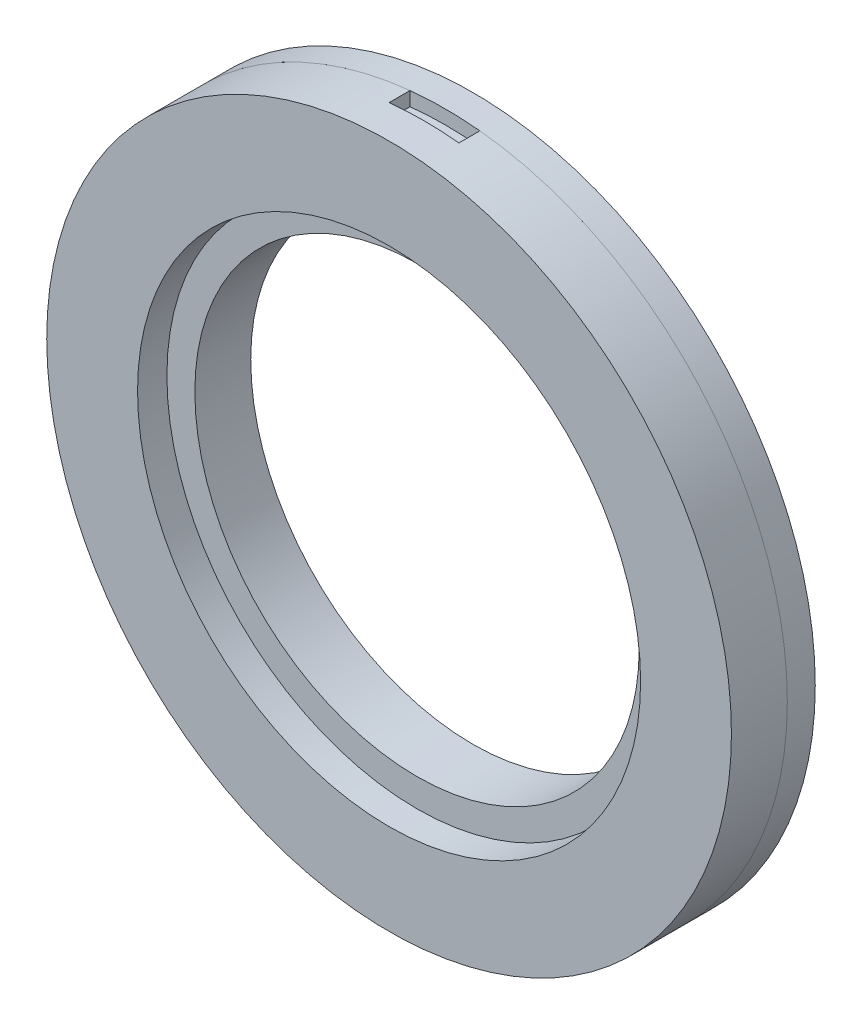
ISO-10303-21;
HEADER;
FILE_DESCRIPTION(('STEP AP214'),'2;1');
FILE_NAME('part.step','',(''),(''),'','','');
FILE_SCHEMA(('AUTOMOTIVE_DESIGN { 1 0 10303 214 1 1 1 1 }'));
ENDSEC;
DATA;
#1=APPLICATION_CONTEXT('core data for automotive mechanical design processes');
#2=APPLICATION_PROTOCOL_DEFINITION('international standard','automotive_design',2000,#1);
#3=PRODUCT_CONTEXT('',#1,'mechanical');
#4=PRODUCT('Part','Part','',(#3));
#5=PRODUCT_RELATED_PRODUCT_CATEGORY('part','',(#4));
#6=PRODUCT_DEFINITION_FORMATION('','',#4);
#7=PRODUCT_DEFINITION_CONTEXT('part definition',#1,'design');
#8=PRODUCT_DEFINITION('design','',#6,#7);
#9=PRODUCT_DEFINITION_SHAPE('','',#8);
#10=(LENGTH_UNIT() NAMED_UNIT(*) SI_UNIT(.MILLI.,.METRE.));
#11=(NAMED_UNIT(*) PLANE_ANGLE_UNIT() SI_UNIT($,.RADIAN.));
#12=(NAMED_UNIT(*) SI_UNIT($,.STERADIAN.) SOLID_ANGLE_UNIT());
#13=UNCERTAINTY_MEASURE_WITH_UNIT(LENGTH_MEASURE(1.E-05),#10,'distance_accuracy_value','');
#14=(GEOMETRIC_REPRESENTATION_CONTEXT(3) GLOBAL_UNCERTAINTY_ASSIGNED_CONTEXT((#13)) GLOBAL_UNIT_ASSIGNED_CONTEXT((#10,
#11,#12)) REPRESENTATION_CONTEXT('',''));
#15=CARTESIAN_POINT('',(0.,0.,0.));
#16=DIRECTION('',(0.,0.,1.));
#17=DIRECTION('',(1.,0.,0.));
#18=AXIS2_PLACEMENT_3D('',#15,#16,#17);
#19=CARTESIAN_POINT('',(0.,0.,0.));
#20=DIRECTION('',(0.,0.,-1.));
#21=DIRECTION('',(-1.,0.,0.));
#22=AXIS2_PLACEMENT_3D('',#19,#20,#21);
#23=PLANE('',#22);
#24=CARTESIAN_POINT('',(0.,0.,0.));
#25=DIRECTION('',(0.,0.,1.));
#26=DIRECTION('',(1.,0.,0.));
#27=AXIS2_PLACEMENT_3D('',#24,#25,#26);
#28=CIRCLE('',#27,17.9);
#29=CARTESIAN_POINT('',(17.9,0.,0.));
#30=VERTEX_POINT('',#29);
#31=EDGE_CURVE('E66',#30,#30,#28,.T.);
#32=ORIENTED_EDGE('',*,*,#31,.F.);
#33=EDGE_LOOP('',(#32));
#34=FACE_BOUND('',#33,.T.);
#35=CARTESIAN_POINT('',(0.,0.,0.));
#36=DIRECTION('',(0.,0.,-1.));
#37=DIRECTION('',(-1.,0.,0.));
#38=AXIS2_PLACEMENT_3D('',#35,#36,#37);
#39=CIRCLE('',#38,20.);
#40=CARTESIAN_POINT('',(-20.,0.,0.));
#41=VERTEX_POINT('',#40);
#42=EDGE_CURVE('E12',#41,#41,#39,.T.);
#43=ORIENTED_EDGE('',*,*,#42,.F.);
#44=EDGE_LOOP('',(#43));
#45=FACE_BOUND('',#44,.T.);
#46=ADVANCED_FACE('F58',(#34,#45),#23,.F.);
#47=CARTESIAN_POINT('',(0.,0.,-2.));
#48=DIRECTION('',(0.,0.,1.));
#49=DIRECTION('',(1.,0.,0.));
#50=AXIS2_PLACEMENT_3D('',#47,#48,#49);
#51=CYLINDRICAL_SURFACE('',#50,24.5);
#52=CARTESIAN_POINT('',(0.,0.,-2.));
#53=DIRECTION('',(0.,0.,-1.));
#54=DIRECTION('',(-1.,0.,0.));
#55=AXIS2_PLACEMENT_3D('',#52,#53,#54);
#56=CIRCLE('',#55,24.5);
#57=CARTESIAN_POINT('',(-24.5,0.,-2.));
#58=VERTEX_POINT('',#57);
#59=EDGE_CURVE('E71',#58,#58,#56,.T.);
#60=ORIENTED_EDGE('',*,*,#59,.F.);
#61=EDGE_LOOP('',(#60));
#62=FACE_BOUND('',#61,.T.);
#63=CARTESIAN_POINT('',(0.,0.,0.));
#64=DIRECTION('',(0.,0.,-1.));
#65=DIRECTION('',(-1.,0.,0.));
#66=AXIS2_PLACEMENT_3D('',#63,#64,#65);
#67=CIRCLE('',#66,24.5);
#68=CARTESIAN_POINT('',(-24.5,0.,0.));
#69=VERTEX_POINT('',#68);
#70=EDGE_CURVE('E62',#69,#69,#67,.T.);
#71=ORIENTED_EDGE('',*,*,#70,.T.);
#72=EDGE_LOOP('',(#71));
#73=FACE_BOUND('',#72,.T.);
#74=ADVANCED_FACE('F60',(#62,#73),#51,.T.);
#75=CARTESIAN_POINT('',(0.,0.,-2.));
#76=DIRECTION('',(0.,0.,-1.));
#77=DIRECTION('',(-1.,0.,0.));
#78=AXIS2_PLACEMENT_3D('',#75,#76,#77);
#79=PLANE('',#78);
#80=CARTESIAN_POINT('',(0.,0.,-2.));
#81=DIRECTION('',(0.,0.,1.));
#82=DIRECTION('',(1.,0.,0.));
#83=AXIS2_PLACEMENT_3D('',#80,#81,#82);
#84=CIRCLE('',#83,15.9);
#85=CARTESIAN_POINT('',(15.9,0.,-2.));
#86=VERTEX_POINT('',#85);
#87=EDGE_CURVE('E82',#86,#86,#84,.T.);
#88=ORIENTED_EDGE('',*,*,#87,.T.);
#89=EDGE_LOOP('',(#88));
#90=FACE_BOUND('',#89,.T.);
#91=ORIENTED_EDGE('',*,*,#59,.T.);
#92=EDGE_LOOP('',(#91));
#93=FACE_BOUND('',#92,.T.);
#94=ADVANCED_FACE('F99',(#90,#93),#79,.T.);
#95=CARTESIAN_POINT('',(0.,0.,0.));
#96=DIRECTION('',(0.,0.,-1.));
#97=DIRECTION('',(-1.,0.,0.));
#98=AXIS2_PLACEMENT_3D('',#95,#96,#97);
#99=CIRCLE('',#98,22.5);
#100=CARTESIAN_POINT('',(-22.5,0.,0.));
#101=VERTEX_POINT('',#100);
#102=EDGE_CURVE('E78',#101,#101,#99,.T.);
#103=ORIENTED_EDGE('',*,*,#102,.T.);
#104=EDGE_LOOP('',(#103));
#105=FACE_BOUND('',#104,.T.);
#106=ORIENTED_EDGE('',*,*,#70,.F.);
#107=EDGE_LOOP('',(#106));
#108=FACE_BOUND('',#107,.T.);
#109=ADVANCED_FACE('F96',(#105,#108),#23,.F.);
#110=CARTESIAN_POINT('',(0.,0.,2.));
#111=DIRECTION('',(0.,0.,-1.));
#112=DIRECTION('',(-1.,0.,0.));
#113=AXIS2_PLACEMENT_3D('',#110,#111,#112);
#114=CYLINDRICAL_SURFACE('',#113,17.9);
#115=CARTESIAN_POINT('',(0.,0.,2.));
#116=DIRECTION('',(0.,0.,1.));
#117=DIRECTION('',(1.,0.,0.));
#118=AXIS2_PLACEMENT_3D('',#115,#116,#117);
#119=CIRCLE('',#118,17.9);
#120=CARTESIAN_POINT('',(17.9,0.,2.));
#121=VERTEX_POINT('',#120);
#122=EDGE_CURVE('E85',#121,#121,#119,.T.);
#123=ORIENTED_EDGE('',*,*,#122,.F.);
#124=EDGE_LOOP('',(#123));
#125=FACE_BOUND('',#124,.T.);
#126=ORIENTED_EDGE('',*,*,#31,.T.);
#127=EDGE_LOOP('',(#126));
#128=FACE_BOUND('',#127,.T.);
#129=ADVANCED_FACE('F98',(#125,#128),#114,.T.);
#130=CARTESIAN_POINT('',(0.,0.,2.));
#131=DIRECTION('',(0.,0.,1.));
#132=DIRECTION('',(1.,0.,0.));
#133=AXIS2_PLACEMENT_3D('',#130,#131,#132);
#134=PLANE('',#133);
#135=CARTESIAN_POINT('',(0.,0.,2.));
#136=DIRECTION('',(0.,0.,1.));
#137=DIRECTION('',(1.,0.,0.));
#138=AXIS2_PLACEMENT_3D('',#135,#136,#137);
#139=CIRCLE('',#138,15.9);
#140=CARTESIAN_POINT('',(15.9,0.,2.));
#141=VERTEX_POINT('',#140);
#142=EDGE_CURVE('E81',#141,#141,#139,.T.);
#143=ORIENTED_EDGE('',*,*,#142,.F.);
#144=EDGE_LOOP('',(#143));
#145=FACE_BOUND('',#144,.T.);
#146=ORIENTED_EDGE('',*,*,#122,.T.);
#147=EDGE_LOOP('',(#146));
#148=FACE_BOUND('',#147,.T.);
#149=ADVANCED_FACE('F105',(#145,#148),#134,.T.);
#150=CARTESIAN_POINT('',(0.,0.,-2.));
#151=DIRECTION('',(0.,0.,1.));
#152=DIRECTION('',(1.,0.,0.));
#153=AXIS2_PLACEMENT_3D('',#150,#151,#152);
#154=CYLINDRICAL_SURFACE('',#153,15.9);
#155=ORIENTED_EDGE('',*,*,#87,.F.);
#156=EDGE_LOOP('',(#155));
#157=FACE_BOUND('',#156,.T.);
#158=ORIENTED_EDGE('',*,*,#142,.T.);
#159=EDGE_LOOP('',(#158));
#160=FACE_BOUND('',#159,.T.);
#161=ADVANCED_FACE('F147',(#157,#160),#154,.F.);
#162=CARTESIAN_POINT('',(-22.5,0.,0.));
#163=CARTESIAN_POINT('',(-21.25,0.,0.400000000000017));
#164=CARTESIAN_POINT('',(-20.,0.,0.));
#165=B_SPLINE_CURVE_WITH_KNOTS('',2,(#162,#163,#164),.UNSPECIFIED.,.F.,.F.,(3,3),(0.,1.),.UNSPECIFIED.);
#166=CARTESIAN_POINT('',(0.,0.,-2.));
#167=DIRECTION('',(0.,0.,-1.));
#168=AXIS1_PLACEMENT('',#166,#167);
#169=SURFACE_OF_REVOLUTION('',#165,#168);
#170=ORIENTED_EDGE('',*,*,#42,.T.);
#171=EDGE_LOOP('',(#170));
#172=FACE_BOUND('',#171,.T.);
#173=ORIENTED_EDGE('',*,*,#102,.F.);
#174=EDGE_LOOP('',(#173));
#175=FACE_BOUND('',#174,.T.);
#176=ADVANCED_FACE('F143',(#172,#175),#169,.F.);
#177=CLOSED_SHELL('',(#46,#74,#94,#109,#129,#149,#161,#176));
#178=MANIFOLD_SOLID_BREP('B2',#177);
#179=CARTESIAN_POINT('',(0.,0.,0.));
#180=DIRECTION('',(0.,0.,1.));
#181=DIRECTION('',(1.,0.,0.));
#182=AXIS2_PLACEMENT_3D('',#179,#180,#181);
#183=PLANE('',#182);
#184=CARTESIAN_POINT('',(0.,0.,0.));
#185=DIRECTION('',(0.,0.,1.));
#186=DIRECTION('',(1.,0.,0.));
#187=AXIS2_PLACEMENT_3D('',#184,#185,#186);
#188=CIRCLE('',#187,22.5);
#189=CARTESIAN_POINT('',(22.5,0.,0.));
#190=VERTEX_POINT('',#189);
#191=EDGE_CURVE('E338',#190,#190,#188,.T.);
#192=ORIENTED_EDGE('',*,*,#191,.T.);
#193=EDGE_LOOP('',(#192));
#194=FACE_BOUND('',#193,.T.);
#195=CARTESIAN_POINT('',(0.,0.,0.));
#196=DIRECTION('',(0.,0.,1.));
#197=DIRECTION('',(1.,0.,0.));
#198=AXIS2_PLACEMENT_3D('',#195,#196,#197);
#199=CIRCLE('',#198,24.5);
#200=CARTESIAN_POINT('',(-2.5,24.3721152139079,0.));
#201=VERTEX_POINT('',#200);
#202=CARTESIAN_POINT('',(-2.5,-24.3721152139079,0.));
#203=VERTEX_POINT('',#202);
#204=EDGE_CURVE('E354',#201,#203,#199,.T.);
#205=ORIENTED_EDGE('',*,*,#204,.F.);
#206=DIRECTION('',(0.,1.,0.));
#207=VECTOR('',#206,1.);
#208=CARTESIAN_POINT('',(-2.5,-26.501,0.));
#209=LINE('',#208,#207);
#210=CARTESIAN_POINT('',(-2.5,23.3666428910958,0.));
#211=VERTEX_POINT('',#210);
#212=EDGE_CURVE('E287',#211,#201,#209,.T.);
#213=ORIENTED_EDGE('',*,*,#212,.F.);
#214=CARTESIAN_POINT('',(0.,0.,0.));
#215=DIRECTION('',(0.,0.,1.));
#216=DIRECTION('',(1.,0.,0.));
#217=AXIS2_PLACEMENT_3D('',#214,#215,#216);
#218=CIRCLE('',#217,23.5);
#219=CARTESIAN_POINT('',(2.5,23.3666428910958,0.));
#220=VERTEX_POINT('',#219);
#221=EDGE_CURVE('E286',#211,#220,#218,.F.);
#222=ORIENTED_EDGE('',*,*,#221,.T.);
#223=DIRECTION('',(0.,1.,0.));
#224=VECTOR('',#223,1.);
#225=CARTESIAN_POINT('',(2.5,-26.501,0.));
#226=LINE('',#225,#224);
#227=CARTESIAN_POINT('',(2.5,24.3721152139079,0.));
#228=VERTEX_POINT('',#227);
#229=EDGE_CURVE('E275',#220,#228,#226,.T.);
#230=ORIENTED_EDGE('',*,*,#229,.T.);
#231=CARTESIAN_POINT('',(2.5,-24.3721152139079,0.));
#232=VERTEX_POINT('',#231);
#233=EDGE_CURVE('E363',#232,#228,#199,.T.);
#234=ORIENTED_EDGE('',*,*,#233,.F.);
#235=DIRECTION('',(0.,-1.,0.));
#236=VECTOR('',#235,1.);
#237=CARTESIAN_POINT('',(2.5,26.501,0.));
#238=LINE('',#237,#236);
#239=CARTESIAN_POINT('',(2.5,-23.3666428910958,0.));
#240=VERTEX_POINT('',#239);
#241=EDGE_CURVE('E314',#240,#232,#238,.T.);
#242=ORIENTED_EDGE('',*,*,#241,.F.);
#243=CARTESIAN_POINT('',(0.,0.,0.));
#244=DIRECTION('',(0.,0.,-1.));
#245=DIRECTION('',(-1.,0.,0.));
#246=AXIS2_PLACEMENT_3D('',#243,#244,#245);
#247=CIRCLE('',#246,23.5);
#248=CARTESIAN_POINT('',(-2.5,-23.3666428910958,0.));
#249=VERTEX_POINT('',#248);
#250=EDGE_CURVE('E311',#249,#240,#247,.F.);
#251=ORIENTED_EDGE('',*,*,#250,.F.);
#252=DIRECTION('',(0.,-1.,0.));
#253=VECTOR('',#252,1.);
#254=CARTESIAN_POINT('',(-2.5,26.501,0.));
#255=LINE('',#254,#253);
#256=EDGE_CURVE('E328',#249,#203,#255,.T.);
#257=ORIENTED_EDGE('',*,*,#256,.T.);
#258=EDGE_LOOP('',(#205,#213,#222,#230,#234,#242,#251,#257));
#259=FACE_BOUND('',#258,.T.);
#260=ADVANCED_FACE('F210',(#194,#259),#183,.F.);
#261=CARTESIAN_POINT('',(0.,0.,0.));
#262=DIRECTION('',(0.,0.,1.));
#263=DIRECTION('',(1.,0.,0.));
#264=AXIS2_PLACEMENT_3D('',#261,#262,#263);
#265=CIRCLE('',#264,18.);
#266=CARTESIAN_POINT('',(18.,0.,0.));
#267=VERTEX_POINT('',#266);
#268=EDGE_CURVE('E346',#267,#267,#265,.T.);
#269=ORIENTED_EDGE('',*,*,#268,.T.);
#270=EDGE_LOOP('',(#269));
#271=FACE_BOUND('',#270,.T.);
#272=CARTESIAN_POINT('',(0.,0.,0.));
#273=DIRECTION('',(0.,0.,1.));
#274=DIRECTION('',(1.,0.,0.));
#275=AXIS2_PLACEMENT_3D('',#272,#273,#274);
#276=CIRCLE('',#275,20.);
#277=CARTESIAN_POINT('',(20.,0.,0.));
#278=VERTEX_POINT('',#277);
#279=EDGE_CURVE('E319',#278,#278,#276,.T.);
#280=ORIENTED_EDGE('',*,*,#279,.F.);
#281=EDGE_LOOP('',(#280));
#282=FACE_BOUND('',#281,.T.);
#283=ADVANCED_FACE('F402',(#271,#282),#183,.F.);
#284=CARTESIAN_POINT('',(0.,0.,4.));
#285=DIRECTION('',(0.,0.,1.));
#286=DIRECTION('',(1.,0.,0.));
#287=AXIS2_PLACEMENT_3D('',#284,#285,#286);
#288=PLANE('',#287);
#289=CARTESIAN_POINT('',(0.,0.,4.));
#290=DIRECTION('',(0.,0.,1.));
#291=DIRECTION('',(1.,0.,0.));
#292=AXIS2_PLACEMENT_3D('',#289,#290,#291);
#293=CIRCLE('',#292,24.5);
#294=CARTESIAN_POINT('',(24.5,0.,4.));
#295=VERTEX_POINT('',#294);
#296=EDGE_CURVE('E358',#295,#295,#293,.T.);
#297=ORIENTED_EDGE('',*,*,#296,.T.);
#298=EDGE_LOOP('',(#297));
#299=FACE_BOUND('',#298,.T.);
#300=CARTESIAN_POINT('',(0.,0.,4.));
#301=DIRECTION('',(0.,0.,1.));
#302=DIRECTION('',(1.,0.,0.));
#303=AXIS2_PLACEMENT_3D('',#300,#301,#302);
#304=CIRCLE('',#303,18.);
#305=CARTESIAN_POINT('',(18.,0.,4.));
#306=VERTEX_POINT('',#305);
#307=EDGE_CURVE('E350',#306,#306,#304,.T.);
#308=ORIENTED_EDGE('',*,*,#307,.F.);
#309=EDGE_LOOP('',(#308));
#310=FACE_BOUND('',#309,.T.);
#311=ADVANCED_FACE('F407',(#299,#310),#288,.T.);
#312=CARTESIAN_POINT('',(0.,0.,4.));
#313=DIRECTION('',(0.,0.,-1.));
#314=DIRECTION('',(-1.,0.,0.));
#315=AXIS2_PLACEMENT_3D('',#312,#313,#314);
#316=CYLINDRICAL_SURFACE('',#315,24.5);
#317=ORIENTED_EDGE('',*,*,#296,.F.);
#318=EDGE_LOOP('',(#317));
#319=FACE_BOUND('',#318,.T.);
#320=CARTESIAN_POINT('',(0.,0.,1.5));
#321=DIRECTION('',(0.,0.,1.));
#322=DIRECTION('',(1.,0.,0.));
#323=AXIS2_PLACEMENT_3D('',#320,#321,#322);
#324=CIRCLE('',#323,24.5);
#325=CARTESIAN_POINT('',(2.5,24.3721152139079,1.5));
#326=VERTEX_POINT('',#325);
#327=CARTESIAN_POINT('',(-2.5,24.3721152139079,1.5));
#328=VERTEX_POINT('',#327);
#329=EDGE_CURVE('E219',#326,#328,#324,.T.);
#330=ORIENTED_EDGE('',*,*,#329,.T.);
#331=DIRECTION('',(0.,0.,-1.));
#332=VECTOR('',#331,1.);
#333=CARTESIAN_POINT('',(-2.5,24.3721152139079,4.));
#334=LINE('',#333,#332);
#335=EDGE_CURVE('E56',#328,#201,#334,.T.);
#336=ORIENTED_EDGE('',*,*,#335,.T.);
#337=ORIENTED_EDGE('',*,*,#204,.T.);
#338=DIRECTION('',(0.,0.,-1.));
#339=VECTOR('',#338,1.);
#340=CARTESIAN_POINT('',(-2.5,-24.3721152139079,4.));
#341=LINE('',#340,#339);
#342=CARTESIAN_POINT('',(-2.5,-24.3721152139079,1.5));
#343=VERTEX_POINT('',#342);
#344=EDGE_CURVE('E362',#343,#203,#341,.T.);
#345=ORIENTED_EDGE('',*,*,#344,.F.);
#346=CARTESIAN_POINT('',(0.,0.,1.5));
#347=DIRECTION('',(0.,0.,-1.));
#348=DIRECTION('',(-1.,0.,0.));
#349=AXIS2_PLACEMENT_3D('',#346,#347,#348);
#350=CIRCLE('',#349,24.5);
#351=CARTESIAN_POINT('',(2.5,-24.3721152139079,1.5));
#352=VERTEX_POINT('',#351);
#353=EDGE_CURVE('E368',#352,#343,#350,.T.);
#354=ORIENTED_EDGE('',*,*,#353,.F.);
#355=DIRECTION('',(0.,0.,-1.));
#356=VECTOR('',#355,1.);
#357=CARTESIAN_POINT('',(2.5,-24.3721152139079,4.));
#358=LINE('',#357,#356);
#359=EDGE_CURVE('E371',#352,#232,#358,.T.);
#360=ORIENTED_EDGE('',*,*,#359,.T.);
#361=ORIENTED_EDGE('',*,*,#233,.T.);
#362=DIRECTION('',(0.,0.,-1.));
#363=VECTOR('',#362,1.);
#364=CARTESIAN_POINT('',(2.5,24.3721152139079,4.));
#365=LINE('',#364,#363);
#366=EDGE_CURVE('E280',#326,#228,#365,.T.);
#367=ORIENTED_EDGE('',*,*,#366,.F.);
#368=EDGE_LOOP('',(#330,#336,#337,#345,#354,#360,#361,#367));
#369=FACE_BOUND('',#368,.T.);
#370=ADVANCED_FACE('F212',(#319,#369),#316,.T.);
#371=CARTESIAN_POINT('',(0.,0.,4.));
#372=DIRECTION('',(0.,0.,-1.));
#373=DIRECTION('',(-1.,0.,0.));
#374=AXIS2_PLACEMENT_3D('',#371,#372,#373);
#375=CYLINDRICAL_SURFACE('',#374,18.);
#376=ORIENTED_EDGE('',*,*,#307,.T.);
#377=EDGE_LOOP('',(#376));
#378=FACE_BOUND('',#377,.T.);
#379=ORIENTED_EDGE('',*,*,#268,.F.);
#380=EDGE_LOOP('',(#379));
#381=FACE_BOUND('',#380,.T.);
#382=ADVANCED_FACE('F413',(#378,#381),#375,.F.);
#383=CARTESIAN_POINT('',(0.,0.,2.));
#384=DIRECTION('',(0.,0.,1.));
#385=DIRECTION('',(1.,0.,0.));
#386=AXIS2_PLACEMENT_3D('',#383,#384,#385);
#387=PLANE('',#386);
#388=CARTESIAN_POINT('',(0.,0.,2.));
#389=DIRECTION('',(0.,0.,1.));
#390=DIRECTION('',(1.,0.,0.));
#391=AXIS2_PLACEMENT_3D('',#388,#389,#390);
#392=CIRCLE('',#391,22.5);
#393=CARTESIAN_POINT('',(22.5,0.,2.));
#394=VERTEX_POINT('',#393);
#395=EDGE_CURVE('E342',#394,#394,#392,.T.);
#396=ORIENTED_EDGE('',*,*,#395,.F.);
#397=EDGE_LOOP('',(#396));
#398=FACE_BOUND('',#397,.T.);
#399=CARTESIAN_POINT('',(0.,0.,2.));
#400=DIRECTION('',(0.,0.,1.));
#401=DIRECTION('',(1.,0.,0.));
#402=AXIS2_PLACEMENT_3D('',#399,#400,#401);
#403=CIRCLE('',#402,20.);
#404=CARTESIAN_POINT('',(20.,0.,2.));
#405=VERTEX_POINT('',#404);
#406=EDGE_CURVE('E334',#405,#405,#403,.T.);
#407=ORIENTED_EDGE('',*,*,#406,.T.);
#408=EDGE_LOOP('',(#407));
#409=FACE_BOUND('',#408,.T.);
#410=ADVANCED_FACE('F416',(#398,#409),#387,.F.);
#411=CARTESIAN_POINT('',(0.,0.,2.));
#412=DIRECTION('',(0.,0.,-1.));
#413=DIRECTION('',(-1.,0.,0.));
#414=AXIS2_PLACEMENT_3D('',#411,#412,#413);
#415=CYLINDRICAL_SURFACE('',#414,22.5);
#416=ORIENTED_EDGE('',*,*,#395,.T.);
#417=EDGE_LOOP('',(#416));
#418=FACE_BOUND('',#417,.T.);
#419=ORIENTED_EDGE('',*,*,#191,.F.);
#420=EDGE_LOOP('',(#419));
#421=FACE_BOUND('',#420,.T.);
#422=ADVANCED_FACE('F418',(#418,#421),#415,.F.);
#423=CARTESIAN_POINT('',(0.,0.,2.));
#424=DIRECTION('',(0.,0.,-1.));
#425=DIRECTION('',(-1.,0.,0.));
#426=AXIS2_PLACEMENT_3D('',#423,#424,#425);
#427=CYLINDRICAL_SURFACE('',#426,20.);
#428=ORIENTED_EDGE('',*,*,#406,.F.);
#429=EDGE_LOOP('',(#428));
#430=FACE_BOUND('',#429,.T.);
#431=ORIENTED_EDGE('',*,*,#279,.T.);
#432=EDGE_LOOP('',(#431));
#433=FACE_BOUND('',#432,.T.);
#434=ADVANCED_FACE('F421',(#430,#433),#427,.T.);
#435=CARTESIAN_POINT('',(0.,26.501,1.5));
#436=DIRECTION('',(0.,0.,-1.));
#437=DIRECTION('',(-1.,0.,0.));
#438=AXIS2_PLACEMENT_3D('',#435,#436,#437);
#439=PLANE('',#438);
#440=ORIENTED_EDGE('',*,*,#353,.T.);
#441=DIRECTION('',(0.,-1.,0.));
#442=VECTOR('',#441,1.);
#443=CARTESIAN_POINT('',(-2.5,26.501,1.5));
#444=LINE('',#443,#442);
#445=CARTESIAN_POINT('',(-2.5,-23.3666428910958,1.5));
#446=VERTEX_POINT('',#445);
#447=EDGE_CURVE('E234',#446,#343,#444,.T.);
#448=ORIENTED_EDGE('',*,*,#447,.F.);
#449=CARTESIAN_POINT('',(0.,0.,1.5));
#450=DIRECTION('',(0.,0.,-1.));
#451=DIRECTION('',(-1.,0.,0.));
#452=AXIS2_PLACEMENT_3D('',#449,#450,#451);
#453=CIRCLE('',#452,23.5);
#454=CARTESIAN_POINT('',(2.5,-23.3666428910958,1.5));
#455=VERTEX_POINT('',#454);
#456=EDGE_CURVE('E315',#446,#455,#453,.F.);
#457=ORIENTED_EDGE('',*,*,#456,.T.);
#458=DIRECTION('',(0.,-1.,0.));
#459=VECTOR('',#458,1.);
#460=CARTESIAN_POINT('',(2.5,26.501,1.5));
#461=LINE('',#460,#459);
#462=EDGE_CURVE('E310',#455,#352,#461,.T.);
#463=ORIENTED_EDGE('',*,*,#462,.T.);
#464=EDGE_LOOP('',(#440,#448,#457,#463));
#465=FACE_BOUND('',#464,.T.);
#466=ADVANCED_FACE('F428',(#465),#439,.T.);
#467=CARTESIAN_POINT('',(2.5,26.501,0.));
#468=DIRECTION('',(1.,0.,0.));
#469=DIRECTION('',(0.,0.,-1.));
#470=AXIS2_PLACEMENT_3D('',#467,#468,#469);
#471=PLANE('',#470);
#472=ORIENTED_EDGE('',*,*,#462,.F.);
#473=DIRECTION('',(0.,0.,-1.));
#474=VECTOR('',#473,1.);
#475=CARTESIAN_POINT('',(2.5,-23.3666428910958,4.));
#476=LINE('',#475,#474);
#477=EDGE_CURVE('E307',#240,#455,#476,.F.);
#478=ORIENTED_EDGE('',*,*,#477,.F.);
#479=ORIENTED_EDGE('',*,*,#241,.T.);
#480=ORIENTED_EDGE('',*,*,#359,.F.);
#481=EDGE_LOOP('',(#472,#478,#479,#480));
#482=FACE_BOUND('',#481,.T.);
#483=ADVANCED_FACE('F436',(#482),#471,.F.);
#484=CARTESIAN_POINT('',(-2.5,26.501,0.));
#485=DIRECTION('',(1.,0.,0.));
#486=DIRECTION('',(0.,0.,-1.));
#487=AXIS2_PLACEMENT_3D('',#484,#485,#486);
#488=PLANE('',#487);
#489=ORIENTED_EDGE('',*,*,#344,.T.);
#490=ORIENTED_EDGE('',*,*,#256,.F.);
#491=DIRECTION('',(0.,0.,-1.));
#492=VECTOR('',#491,1.);
#493=CARTESIAN_POINT('',(-2.5,-23.3666428910958,4.));
#494=LINE('',#493,#492);
#495=EDGE_CURVE('E320',#249,#446,#494,.F.);
#496=ORIENTED_EDGE('',*,*,#495,.T.);
#497=ORIENTED_EDGE('',*,*,#447,.T.);
#498=EDGE_LOOP('',(#489,#490,#496,#497));
#499=FACE_BOUND('',#498,.T.);
#500=ADVANCED_FACE('F432',(#499),#488,.T.);
#501=CARTESIAN_POINT('',(0.,0.,4.));
#502=DIRECTION('',(0.,0.,-1.));
#503=DIRECTION('',(-1.,0.,0.));
#504=AXIS2_PLACEMENT_3D('',#501,#502,#503);
#505=CYLINDRICAL_SURFACE('',#504,23.5);
#506=ORIENTED_EDGE('',*,*,#495,.F.);
#507=ORIENTED_EDGE('',*,*,#250,.T.);
#508=ORIENTED_EDGE('',*,*,#477,.T.);
#509=ORIENTED_EDGE('',*,*,#456,.F.);
#510=EDGE_LOOP('',(#506,#507,#508,#509));
#511=FACE_BOUND('',#510,.T.);
#512=ADVANCED_FACE('F399',(#511),#505,.T.);
#513=CARTESIAN_POINT('',(0.,-26.501,1.5));
#514=DIRECTION('',(0.,0.,1.));
#515=DIRECTION('',(1.,0.,0.));
#516=AXIS2_PLACEMENT_3D('',#513,#514,#515);
#517=PLANE('',#516);
#518=DIRECTION('',(0.,1.,0.));
#519=VECTOR('',#518,1.);
#520=CARTESIAN_POINT('',(2.5,-26.501,1.5));
#521=LINE('',#520,#519);
#522=CARTESIAN_POINT('',(2.5,23.3666428910958,1.5));
#523=VERTEX_POINT('',#522);
#524=EDGE_CURVE('E226',#523,#326,#521,.T.);
#525=ORIENTED_EDGE('',*,*,#524,.F.);
#526=CARTESIAN_POINT('',(0.,0.,1.5));
#527=DIRECTION('',(0.,0.,1.));
#528=DIRECTION('',(1.,0.,0.));
#529=AXIS2_PLACEMENT_3D('',#526,#527,#528);
#530=CIRCLE('',#529,23.5);
#531=CARTESIAN_POINT('',(-2.5,23.3666428910958,1.5));
#532=VERTEX_POINT('',#531);
#533=EDGE_CURVE('E294',#532,#523,#530,.F.);
#534=ORIENTED_EDGE('',*,*,#533,.F.);
#535=DIRECTION('',(0.,1.,0.));
#536=VECTOR('',#535,1.);
#537=CARTESIAN_POINT('',(-2.5,-26.501,1.5));
#538=LINE('',#537,#536);
#539=EDGE_CURVE('E303',#532,#328,#538,.T.);
#540=ORIENTED_EDGE('',*,*,#539,.T.);
#541=ORIENTED_EDGE('',*,*,#329,.F.);
#542=EDGE_LOOP('',(#525,#534,#540,#541));
#543=FACE_BOUND('',#542,.T.);
#544=ADVANCED_FACE('F381',(#543),#517,.F.);
#545=CARTESIAN_POINT('',(-2.5,-26.501,0.));
#546=DIRECTION('',(-1.,0.,0.));
#547=DIRECTION('',(0.,0.,1.));
#548=AXIS2_PLACEMENT_3D('',#545,#546,#547);
#549=PLANE('',#548);
#550=ORIENTED_EDGE('',*,*,#539,.F.);
#551=DIRECTION('',(0.,0.,-1.));
#552=VECTOR('',#551,1.);
#553=CARTESIAN_POINT('',(-2.5,23.3666428910958,4.));
#554=LINE('',#553,#552);
#555=EDGE_CURVE('E385',#211,#532,#554,.F.);
#556=ORIENTED_EDGE('',*,*,#555,.F.);
#557=ORIENTED_EDGE('',*,*,#212,.T.);
#558=ORIENTED_EDGE('',*,*,#335,.F.);
#559=EDGE_LOOP('',(#550,#556,#557,#558));
#560=FACE_BOUND('',#559,.T.);
#561=ADVANCED_FACE('F391',(#560),#549,.F.);
#562=CARTESIAN_POINT('',(2.5,-26.501,0.));
#563=DIRECTION('',(-1.,0.,0.));
#564=DIRECTION('',(0.,0.,1.));
#565=AXIS2_PLACEMENT_3D('',#562,#563,#564);
#566=PLANE('',#565);
#567=ORIENTED_EDGE('',*,*,#366,.T.);
#568=ORIENTED_EDGE('',*,*,#229,.F.);
#569=DIRECTION('',(0.,0.,-1.));
#570=VECTOR('',#569,1.);
#571=CARTESIAN_POINT('',(2.5,23.3666428910958,4.));
#572=LINE('',#571,#570);
#573=EDGE_CURVE('E278',#220,#523,#572,.F.);
#574=ORIENTED_EDGE('',*,*,#573,.T.);
#575=ORIENTED_EDGE('',*,*,#524,.T.);
#576=EDGE_LOOP('',(#567,#568,#574,#575));
#577=FACE_BOUND('',#576,.T.);
#578=ADVANCED_FACE('F277',(#577),#566,.T.);
#579=CARTESIAN_POINT('',(0.,0.,4.));
#580=DIRECTION('',(0.,0.,-1.));
#581=DIRECTION('',(-1.,0.,0.));
#582=AXIS2_PLACEMENT_3D('',#579,#580,#581);
#583=CYLINDRICAL_SURFACE('',#582,23.5);
#584=ORIENTED_EDGE('',*,*,#533,.T.);
#585=ORIENTED_EDGE('',*,*,#573,.F.);
#586=ORIENTED_EDGE('',*,*,#221,.F.);
#587=ORIENTED_EDGE('',*,*,#555,.T.);
#588=EDGE_LOOP('',(#584,#585,#586,#587));
#589=FACE_BOUND('',#588,.T.);
#590=ADVANCED_FACE('F291',(#589),#583,.T.);
#591=CLOSED_SHELL('',(#260,#283,#311,#370,#382,#410,#422,#434,#466,#483,#500,#512,#544,#561,
#578,#590));
#592=MANIFOLD_SOLID_BREP('B7',#591);
#593=ADVANCED_BREP_SHAPE_REPRESENTATION('',(#18,#178,#592),#14);
#594=SHAPE_DEFINITION_REPRESENTATION(#9,#593);
ENDSEC;
END-ISO-10303-21;
